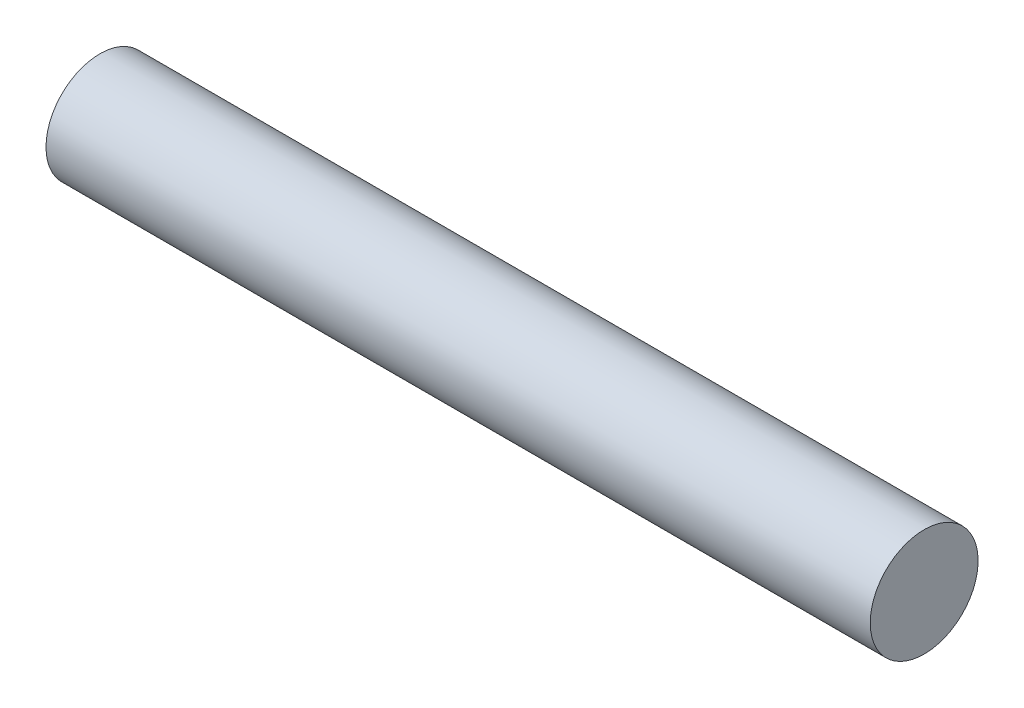
ISO-10303-21;
HEADER;
FILE_DESCRIPTION(('STEP AP214'),'2;1');
FILE_NAME('part.step','',(''),(''),'','','');
FILE_SCHEMA(('AUTOMOTIVE_DESIGN { 1 0 10303 214 1 1 1 1 }'));
ENDSEC;
DATA;
#1=APPLICATION_CONTEXT('core data for automotive mechanical design processes');
#2=APPLICATION_PROTOCOL_DEFINITION('international standard','automotive_design',2000,#1);
#3=PRODUCT_CONTEXT('',#1,'mechanical');
#4=PRODUCT('Part','Part','',(#3));
#5=PRODUCT_RELATED_PRODUCT_CATEGORY('part','',(#4));
#6=PRODUCT_DEFINITION_FORMATION('','',#4);
#7=PRODUCT_DEFINITION_CONTEXT('part definition',#1,'design');
#8=PRODUCT_DEFINITION('design','',#6,#7);
#9=PRODUCT_DEFINITION_SHAPE('','',#8);
#10=(LENGTH_UNIT() NAMED_UNIT(*) SI_UNIT(.MILLI.,.METRE.));
#11=(NAMED_UNIT(*) PLANE_ANGLE_UNIT() SI_UNIT($,.RADIAN.));
#12=(NAMED_UNIT(*) SI_UNIT($,.STERADIAN.) SOLID_ANGLE_UNIT());
#13=UNCERTAINTY_MEASURE_WITH_UNIT(LENGTH_MEASURE(1.E-05),#10,'distance_accuracy_value','');
#14=(GEOMETRIC_REPRESENTATION_CONTEXT(3) GLOBAL_UNCERTAINTY_ASSIGNED_CONTEXT((#13)) GLOBAL_UNIT_ASSIGNED_CONTEXT((#10,
#11,#12)) REPRESENTATION_CONTEXT('',''));
#15=CARTESIAN_POINT('',(0.,0.,0.));
#16=DIRECTION('',(0.,0.,1.));
#17=DIRECTION('',(1.,0.,0.));
#18=AXIS2_PLACEMENT_3D('',#15,#16,#17);
#19=CARTESIAN_POINT('',(0.,0.,0.));
#20=DIRECTION('',(1.,0.,0.));
#21=DIRECTION('',(0.,0.,-1.));
#22=AXIS2_PLACEMENT_3D('',#19,#20,#21);
#23=PLANE('',#22);
#24=CARTESIAN_POINT('',(0.,0.,0.));
#25=DIRECTION('',(-1.,0.,0.));
#26=DIRECTION('',(0.,0.,1.));
#27=AXIS2_PLACEMENT_3D('',#24,#25,#26);
#28=CIRCLE('',#27,7.);
#29=CARTESIAN_POINT('',(0.,0.,7.));
#30=VERTEX_POINT('',#29);
#31=EDGE_CURVE('E10',#30,#30,#28,.T.);
#32=ORIENTED_EDGE('',*,*,#31,.T.);
#33=EDGE_LOOP('',(#32));
#34=FACE_BOUND('',#33,.T.);
#35=ADVANCED_FACE('F39',(#34),#23,.F.);
#36=CARTESIAN_POINT('',(0.,0.,0.));
#37=DIRECTION('',(-1.,0.,0.));
#38=DIRECTION('',(0.,0.,1.));
#39=AXIS2_PLACEMENT_3D('',#36,#37,#38);
#40=CYLINDRICAL_SURFACE('',#39,7.);
#41=ORIENTED_EDGE('',*,*,#31,.F.);
#42=EDGE_LOOP('',(#41));
#43=FACE_BOUND('',#42,.T.);
#44=CARTESIAN_POINT('',(107.,0.,0.));
#45=DIRECTION('',(-1.,0.,0.));
#46=DIRECTION('',(0.,0.,1.));
#47=AXIS2_PLACEMENT_3D('',#44,#45,#46);
#48=CIRCLE('',#47,7.);
#49=CARTESIAN_POINT('',(107.,0.,7.));
#50=VERTEX_POINT('',#49);
#51=EDGE_CURVE('E45',#50,#50,#48,.T.);
#52=ORIENTED_EDGE('',*,*,#51,.T.);
#53=EDGE_LOOP('',(#52));
#54=FACE_BOUND('',#53,.T.);
#55=ADVANCED_FACE('F51',(#43,#54),#40,.T.);
#56=CARTESIAN_POINT('',(107.,7.,0.));
#57=DIRECTION('',(-1.,0.,0.));
#58=DIRECTION('',(0.,0.,1.));
#59=AXIS2_PLACEMENT_3D('',#56,#57,#58);
#60=PLANE('',#59);
#61=ORIENTED_EDGE('',*,*,#51,.F.);
#62=EDGE_LOOP('',(#61));
#63=FACE_BOUND('',#62,.T.);
#64=ADVANCED_FACE('F53',(#63),#60,.F.);
#65=CLOSED_SHELL('',(#35,#55,#64));
#66=MANIFOLD_SOLID_BREP('B2',#65);
#67=ADVANCED_BREP_SHAPE_REPRESENTATION('',(#18,#66),#14);
#68=SHAPE_DEFINITION_REPRESENTATION(#9,#67);
ENDSEC;
END-ISO-10303-21;
